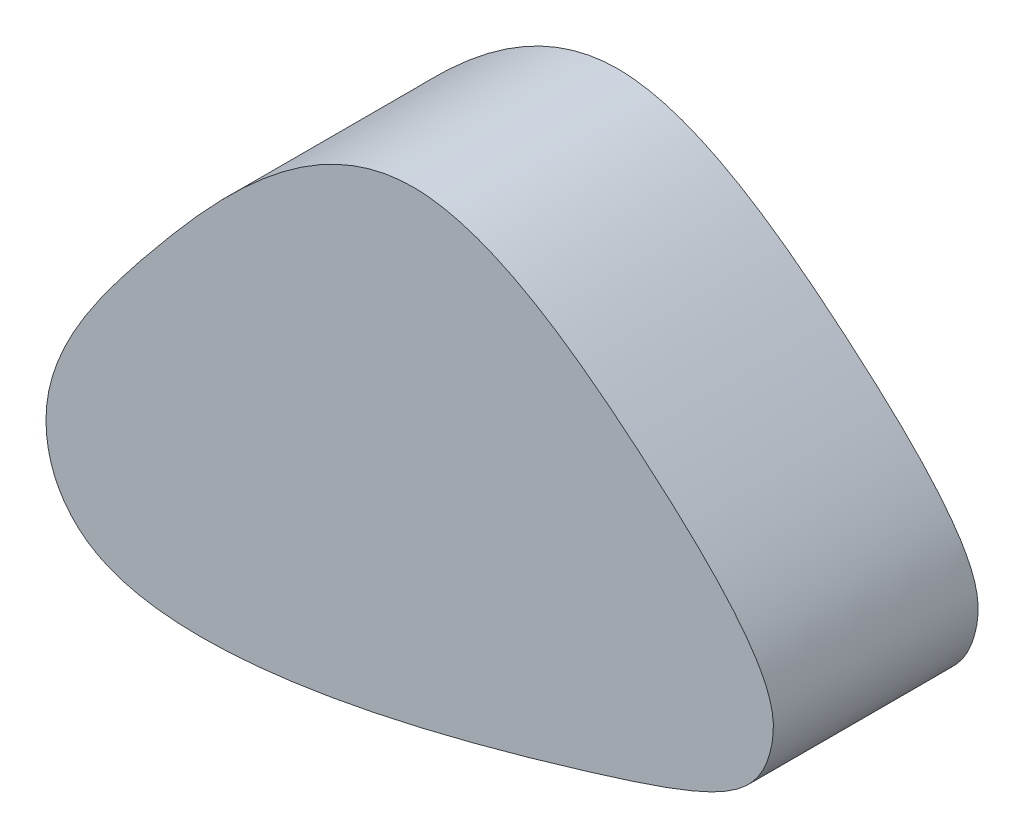
ISO-10303-21;
HEADER;
FILE_DESCRIPTION(('STEP AP214'),'2;1');
FILE_NAME('part.step','',(''),(''),'','','');
FILE_SCHEMA(('AUTOMOTIVE_DESIGN { 1 0 10303 214 1 1 1 1 }'));
ENDSEC;
DATA;
#1=APPLICATION_CONTEXT('core data for automotive mechanical design processes');
#2=APPLICATION_PROTOCOL_DEFINITION('international standard','automotive_design',2000,#1);
#3=PRODUCT_CONTEXT('',#1,'mechanical');
#4=PRODUCT('Part','Part','',(#3));
#5=PRODUCT_RELATED_PRODUCT_CATEGORY('part','',(#4));
#6=PRODUCT_DEFINITION_FORMATION('','',#4);
#7=PRODUCT_DEFINITION_CONTEXT('part definition',#1,'design');
#8=PRODUCT_DEFINITION('design','',#6,#7);
#9=PRODUCT_DEFINITION_SHAPE('','',#8);
#10=(LENGTH_UNIT() NAMED_UNIT(*) SI_UNIT(.MILLI.,.METRE.));
#11=(NAMED_UNIT(*) PLANE_ANGLE_UNIT() SI_UNIT($,.RADIAN.));
#12=(NAMED_UNIT(*) SI_UNIT($,.STERADIAN.) SOLID_ANGLE_UNIT());
#13=UNCERTAINTY_MEASURE_WITH_UNIT(LENGTH_MEASURE(1.E-05),#10,'distance_accuracy_value','');
#14=(GEOMETRIC_REPRESENTATION_CONTEXT(3) GLOBAL_UNCERTAINTY_ASSIGNED_CONTEXT((#13)) GLOBAL_UNIT_ASSIGNED_CONTEXT((#10,
#11,#12)) REPRESENTATION_CONTEXT('',''));
#15=CARTESIAN_POINT('',(0.,0.,0.));
#16=DIRECTION('',(0.,0.,1.));
#17=DIRECTION('',(1.,0.,0.));
#18=AXIS2_PLACEMENT_3D('',#15,#16,#17);
#19=CARTESIAN_POINT('',(0.,0.,0.));
#20=DIRECTION('',(0.,0.,1.));
#21=DIRECTION('',(1.,0.,0.));
#22=AXIS2_PLACEMENT_3D('',#19,#20,#21);
#23=PLANE('',#22);
#24=CARTESIAN_POINT('',(8.54172580805677,15.2498188668853,0.));
#25=CARTESIAN_POINT('',(7.10214642962514,15.2542696246491,0.));
#26=CARTESIAN_POINT('',(4.94740864862198,12.9558826582457,0.));
#27=CARTESIAN_POINT('',(2.77164510424887,9.98410806105316,0.));
#28=CARTESIAN_POINT('',(3.93912798171737,7.11846827090321,0.));
#29=CARTESIAN_POINT('',(12.4299125451246,9.40036662231892,0.));
#30=CARTESIAN_POINT('',(13.7035302296357,10.0371754645744,0.));
#31=CARTESIAN_POINT('',(13.9157998437209,11.6291975702133,0.));
#32=CARTESIAN_POINT('',(11.952305913433,13.5926915005012,0.));
#33=CARTESIAN_POINT('',(9.66262022071278,15.246353389688,0.));
#34=CARTESIAN_POINT('',(8.54172580805677,15.2498188668853,0.));
#35=B_SPLINE_CURVE_WITH_KNOTS('',3,(#24,#25,#26,#27,#28,#29,#30,#31,#32,#33,#34),.UNSPECIFIED.,
.T.,.F.,(4,1,1,1,1,1,1,1,4),(0.,0.168441246645845,0.274553683783095,0.348970998275594,
0.530847194453495,0.704838041993322,0.748115377600436,0.868847209778846,1.),.UNSPECIFIED.);
#36=CARTESIAN_POINT('',(8.54172580805677,15.2498188668853,0.));
#37=VERTEX_POINT('',#36);
#38=EDGE_CURVE('E10',#37,#37,#35,.T.);
#39=ORIENTED_EDGE('',*,*,#38,.F.);
#40=EDGE_LOOP('',(#39));
#41=FACE_BOUND('',#40,.T.);
#42=ADVANCED_FACE('F37',(#41),#23,.F.);
#43=CARTESIAN_POINT('',(8.54172580805677,15.2498188668853,10.));
#44=CARTESIAN_POINT('',(7.10214642962514,15.2542696246491,10.));
#45=CARTESIAN_POINT('',(4.94740864862198,12.9558826582457,10.));
#46=CARTESIAN_POINT('',(2.77164510424887,9.98410806105316,10.));
#47=CARTESIAN_POINT('',(3.93912798171737,7.11846827090321,10.));
#48=CARTESIAN_POINT('',(12.4299125451246,9.40036662231892,10.));
#49=CARTESIAN_POINT('',(13.7035302296357,10.0371754645744,10.));
#50=CARTESIAN_POINT('',(13.9157998437209,11.6291975702133,10.));
#51=CARTESIAN_POINT('',(11.952305913433,13.5926915005012,10.));
#52=CARTESIAN_POINT('',(9.66262022071278,15.246353389688,10.));
#53=CARTESIAN_POINT('',(8.54172580805677,15.2498188668853,10.));
#54=B_SPLINE_CURVE_WITH_KNOTS('',3,(#43,#44,#45,#46,#47,#48,#49,#50,#51,#52,#53),.UNSPECIFIED.,
.T.,.F.,(4,1,1,1,1,1,1,1,4),(0.,0.168441246645845,0.274553683783095,0.348970998275594,
0.530847194453495,0.704838041993322,0.748115377600436,0.868847209778846,1.),.UNSPECIFIED.);
#55=DIRECTION('',(0.,0.,-1.));
#56=VECTOR('',#55,1.);
#57=SURFACE_OF_LINEAR_EXTRUSION('',#54,#56);
#58=CARTESIAN_POINT('',(8.54172580805677,15.2498188668853,3.));
#59=CARTESIAN_POINT('',(7.10214642962514,15.2542696246491,3.));
#60=CARTESIAN_POINT('',(4.94740864862198,12.9558826582457,3.));
#61=CARTESIAN_POINT('',(2.77164510424887,9.98410806105316,3.));
#62=CARTESIAN_POINT('',(3.93912798171737,7.11846827090321,3.));
#63=CARTESIAN_POINT('',(12.4299125451246,9.40036662231892,3.));
#64=CARTESIAN_POINT('',(13.7035302296357,10.0371754645744,3.));
#65=CARTESIAN_POINT('',(13.9157998437209,11.6291975702133,3.));
#66=CARTESIAN_POINT('',(11.952305913433,13.5926915005012,3.));
#67=CARTESIAN_POINT('',(9.66262022071278,15.246353389688,3.));
#68=CARTESIAN_POINT('',(8.54172580805677,15.2498188668853,3.));
#69=B_SPLINE_CURVE_WITH_KNOTS('',3,(#58,#59,#60,#61,#62,#63,#64,#65,#66,#67,#68),.UNSPECIFIED.,
.T.,.F.,(4,1,1,1,1,1,1,1,4),(0.,0.168441246645845,0.274553683783095,0.348970998275594,
0.530847194453495,0.704838041993322,0.748115377600436,0.868847209778846,1.),.UNSPECIFIED.);
#70=CARTESIAN_POINT('',(8.54172580805677,15.2498188668853,3.));
#71=VERTEX_POINT('',#70);
#72=EDGE_CURVE('E47',#71,#71,#69,.F.);
#73=ORIENTED_EDGE('',*,*,#72,.T.);
#74=EDGE_LOOP('',(#73));
#75=FACE_BOUND('',#74,.T.);
#76=ORIENTED_EDGE('',*,*,#38,.T.);
#77=EDGE_LOOP('',(#76));
#78=FACE_BOUND('',#77,.T.);
#79=ADVANCED_FACE('F64',(#75,#78),#57,.F.);
#80=CARTESIAN_POINT('',(0.,0.,3.));
#81=DIRECTION('',(0.,0.,1.));
#82=DIRECTION('',(1.,0.,0.));
#83=AXIS2_PLACEMENT_3D('',#80,#81,#82);
#84=PLANE('',#83);
#85=ORIENTED_EDGE('',*,*,#72,.F.);
#86=EDGE_LOOP('',(#85));
#87=FACE_BOUND('',#86,.T.);
#88=ADVANCED_FACE('F39',(#87),#84,.T.);
#89=CLOSED_SHELL('',(#42,#79,#88));
#90=MANIFOLD_SOLID_BREP('B2',#89);
#91=ADVANCED_BREP_SHAPE_REPRESENTATION('',(#18,#90),#14);
#92=SHAPE_DEFINITION_REPRESENTATION(#9,#91);
ENDSEC;
END-ISO-10303-21;
